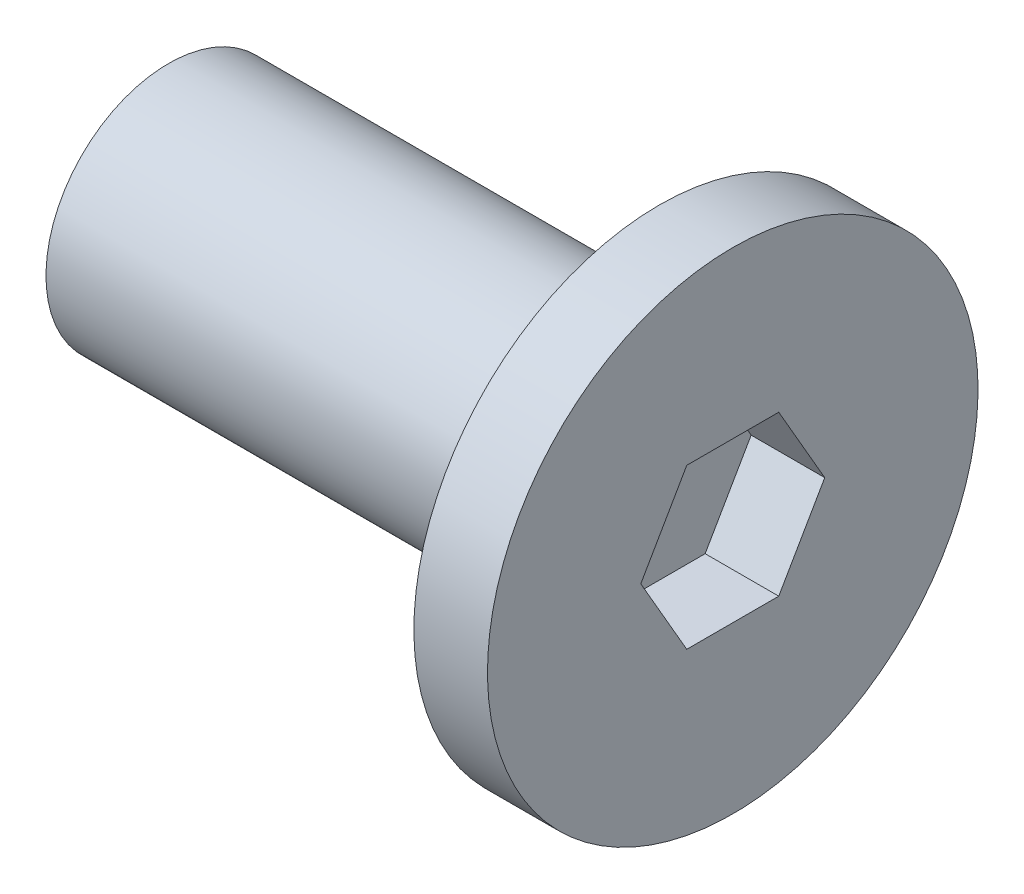
ISO-10303-21;
HEADER;
FILE_DESCRIPTION(('STEP AP214'),'2;1');
FILE_NAME('part.step','',(''),(''),'','','');
FILE_SCHEMA(('AUTOMOTIVE_DESIGN { 1 0 10303 214 1 1 1 1 }'));
ENDSEC;
DATA;
#1=APPLICATION_CONTEXT('core data for automotive mechanical design processes');
#2=APPLICATION_PROTOCOL_DEFINITION('international standard','automotive_design',2000,#1);
#3=PRODUCT_CONTEXT('',#1,'mechanical');
#4=PRODUCT('Part','Part','',(#3));
#5=PRODUCT_RELATED_PRODUCT_CATEGORY('part','',(#4));
#6=PRODUCT_DEFINITION_FORMATION('','',#4);
#7=PRODUCT_DEFINITION_CONTEXT('part definition',#1,'design');
#8=PRODUCT_DEFINITION('design','',#6,#7);
#9=PRODUCT_DEFINITION_SHAPE('','',#8);
#10=(LENGTH_UNIT() NAMED_UNIT(*) SI_UNIT(.MILLI.,.METRE.));
#11=(NAMED_UNIT(*) PLANE_ANGLE_UNIT() SI_UNIT($,.RADIAN.));
#12=(NAMED_UNIT(*) SI_UNIT($,.STERADIAN.) SOLID_ANGLE_UNIT());
#13=UNCERTAINTY_MEASURE_WITH_UNIT(LENGTH_MEASURE(1.E-05),#10,'distance_accuracy_value','');
#14=(GEOMETRIC_REPRESENTATION_CONTEXT(3) GLOBAL_UNCERTAINTY_ASSIGNED_CONTEXT((#13)) GLOBAL_UNIT_ASSIGNED_CONTEXT((#10,
#11,#12)) REPRESENTATION_CONTEXT('',''));
#15=CARTESIAN_POINT('',(0.,0.,0.));
#16=DIRECTION('',(0.,0.,1.));
#17=DIRECTION('',(1.,0.,0.));
#18=AXIS2_PLACEMENT_3D('',#15,#16,#17);
#19=CARTESIAN_POINT('',(0.,4.,0.));
#20=DIRECTION('',(1.,0.,0.));
#21=DIRECTION('',(0.,1.,0.));
#22=AXIS2_PLACEMENT_3D('',#19,#20,#21);
#23=PLANE('',#22);
#24=DIRECTION('',(0.,0.866025403784439,0.5));
#25=VECTOR('',#24,1.);
#26=CARTESIAN_POINT('',(0.,0.,-1.5));
#27=LINE('',#26,#25);
#28=CARTESIAN_POINT('',(0.,0.,-1.5));
#29=VERTEX_POINT('',#28);
#30=CARTESIAN_POINT('',(0.,1.29903810567666,-0.750000000000001));
#31=VERTEX_POINT('',#30);
#32=EDGE_CURVE('E55',#29,#31,#27,.T.);
#33=ORIENTED_EDGE('',*,*,#32,.F.);
#34=DIRECTION('',(0.,0.866025403784439,-0.5));
#35=VECTOR('',#34,1.);
#36=CARTESIAN_POINT('',(0.,-1.29903810567666,-0.750000000000001));
#37=LINE('',#36,#35);
#38=CARTESIAN_POINT('',(0.,-1.29903810567666,-0.750000000000001));
#39=VERTEX_POINT('',#38);
#40=EDGE_CURVE('E138',#39,#29,#37,.T.);
#41=ORIENTED_EDGE('',*,*,#40,.F.);
#42=DIRECTION('',(0.,0.,-1.));
#43=VECTOR('',#42,1.);
#44=CARTESIAN_POINT('',(0.,-1.29903810567666,0.749999999999999));
#45=LINE('',#44,#43);
#46=CARTESIAN_POINT('',(0.,-1.29903810567666,0.749999999999999));
#47=VERTEX_POINT('',#46);
#48=EDGE_CURVE('E136',#47,#39,#45,.T.);
#49=ORIENTED_EDGE('',*,*,#48,.F.);
#50=DIRECTION('',(0.,-0.866025403784439,-0.5));
#51=VECTOR('',#50,1.);
#52=CARTESIAN_POINT('',(0.,0.,1.5));
#53=LINE('',#52,#51);
#54=CARTESIAN_POINT('',(0.,0.,1.5));
#55=VERTEX_POINT('',#54);
#56=EDGE_CURVE('E103',#55,#47,#53,.T.);
#57=ORIENTED_EDGE('',*,*,#56,.F.);
#58=DIRECTION('',(0.,-0.866025403784439,0.5));
#59=VECTOR('',#58,1.);
#60=CARTESIAN_POINT('',(0.,1.29903810567666,0.749999999999999));
#61=LINE('',#60,#59);
#62=CARTESIAN_POINT('',(0.,1.29903810567666,0.749999999999999));
#63=VERTEX_POINT('',#62);
#64=EDGE_CURVE('E132',#63,#55,#61,.T.);
#65=ORIENTED_EDGE('',*,*,#64,.F.);
#66=DIRECTION('',(0.,0.,1.));
#67=VECTOR('',#66,1.);
#68=CARTESIAN_POINT('',(0.,1.29903810567666,-0.750000000000001));
#69=LINE('',#68,#67);
#70=EDGE_CURVE('E129',#31,#63,#69,.T.);
#71=ORIENTED_EDGE('',*,*,#70,.F.);
#72=EDGE_LOOP('',(#33,#41,#49,#57,#65,#71));
#73=FACE_BOUND('',#72,.T.);
#74=CARTESIAN_POINT('',(0.,0.,0.));
#75=DIRECTION('',(1.,0.,0.));
#76=DIRECTION('',(0.,1.,0.));
#77=AXIS2_PLACEMENT_3D('',#74,#75,#76);
#78=CIRCLE('',#77,4.);
#79=CARTESIAN_POINT('',(0.,4.,0.));
#80=VERTEX_POINT('',#79);
#81=EDGE_CURVE('E149',#80,#80,#78,.T.);
#82=ORIENTED_EDGE('',*,*,#81,.T.);
#83=EDGE_LOOP('',(#82));
#84=FACE_BOUND('',#83,.T.);
#85=ADVANCED_FACE('F40',(#73,#84),#23,.T.);
#86=CARTESIAN_POINT('',(-1.2,0.,0.));
#87=DIRECTION('',(-1.,0.,0.));
#88=DIRECTION('',(0.,-1.,0.));
#89=AXIS2_PLACEMENT_3D('',#86,#87,#88);
#90=PLANE('',#89);
#91=CARTESIAN_POINT('',(-1.2,0.,0.));
#92=DIRECTION('',(-1.,0.,0.));
#93=DIRECTION('',(0.,-1.,0.));
#94=AXIS2_PLACEMENT_3D('',#91,#92,#93);
#95=CIRCLE('',#94,2.);
#96=CARTESIAN_POINT('',(-1.2,-2.,0.));
#97=VERTEX_POINT('',#96);
#98=EDGE_CURVE('E11',#97,#97,#95,.T.);
#99=ORIENTED_EDGE('',*,*,#98,.F.);
#100=EDGE_LOOP('',(#99));
#101=FACE_BOUND('',#100,.T.);
#102=CARTESIAN_POINT('',(-1.2,0.,0.));
#103=DIRECTION('',(1.,0.,0.));
#104=DIRECTION('',(0.,1.,0.));
#105=AXIS2_PLACEMENT_3D('',#102,#103,#104);
#106=CIRCLE('',#105,4.);
#107=CARTESIAN_POINT('',(-1.2,4.,0.));
#108=VERTEX_POINT('',#107);
#109=EDGE_CURVE('E43',#108,#108,#106,.T.);
#110=ORIENTED_EDGE('',*,*,#109,.F.);
#111=EDGE_LOOP('',(#110));
#112=FACE_BOUND('',#111,.T.);
#113=ADVANCED_FACE('F159',(#101,#112),#90,.T.);
#114=CARTESIAN_POINT('',(0.,0.,0.));
#115=DIRECTION('',(1.,0.,0.));
#116=DIRECTION('',(0.,1.,0.));
#117=AXIS2_PLACEMENT_3D('',#114,#115,#116);
#118=CYLINDRICAL_SURFACE('',#117,4.);
#119=ORIENTED_EDGE('',*,*,#109,.T.);
#120=EDGE_LOOP('',(#119));
#121=FACE_BOUND('',#120,.T.);
#122=ORIENTED_EDGE('',*,*,#81,.F.);
#123=EDGE_LOOP('',(#122));
#124=FACE_BOUND('',#123,.T.);
#125=ADVANCED_FACE('F156',(#121,#124),#118,.T.);
#126=CARTESIAN_POINT('',(-9.2,0.,0.));
#127=DIRECTION('',(1.,0.,0.));
#128=DIRECTION('',(0.,1.,0.));
#129=AXIS2_PLACEMENT_3D('',#126,#127,#128);
#130=CYLINDRICAL_SURFACE('',#129,2.);
#131=CARTESIAN_POINT('',(-9.2,0.,0.));
#132=DIRECTION('',(-1.,0.,0.));
#133=DIRECTION('',(0.,-1.,0.));
#134=AXIS2_PLACEMENT_3D('',#131,#132,#133);
#135=CIRCLE('',#134,2.);
#136=CARTESIAN_POINT('',(-9.2,-2.,0.));
#137=VERTEX_POINT('',#136);
#138=EDGE_CURVE('E142',#137,#137,#135,.T.);
#139=ORIENTED_EDGE('',*,*,#138,.F.);
#140=EDGE_LOOP('',(#139));
#141=FACE_BOUND('',#140,.T.);
#142=ORIENTED_EDGE('',*,*,#98,.T.);
#143=EDGE_LOOP('',(#142));
#144=FACE_BOUND('',#143,.T.);
#145=ADVANCED_FACE('F166',(#141,#144),#130,.T.);
#146=CARTESIAN_POINT('',(-9.2,0.,0.));
#147=DIRECTION('',(-1.,0.,0.));
#148=DIRECTION('',(0.,-1.,0.));
#149=AXIS2_PLACEMENT_3D('',#146,#147,#148);
#150=PLANE('',#149);
#151=ORIENTED_EDGE('',*,*,#138,.T.);
#152=EDGE_LOOP('',(#151));
#153=FACE_BOUND('',#152,.T.);
#154=ADVANCED_FACE('F173',(#153),#150,.T.);
#155=CARTESIAN_POINT('',(-1.2,0.,-1.5));
#156=DIRECTION('',(0.,0.5,-0.866025403784439));
#157=DIRECTION('',(0.,0.866025403784439,0.5));
#158=AXIS2_PLACEMENT_3D('',#155,#156,#157);
#159=PLANE('',#158);
#160=ORIENTED_EDGE('',*,*,#32,.T.);
#161=DIRECTION('',(1.,0.,0.));
#162=VECTOR('',#161,1.);
#163=CARTESIAN_POINT('',(-1.2,1.29903810567666,-0.750000000000001));
#164=LINE('',#163,#162);
#165=CARTESIAN_POINT('',(-1.2,1.29903810567666,-0.750000000000001));
#166=VERTEX_POINT('',#165);
#167=EDGE_CURVE('E85',#166,#31,#164,.T.);
#168=ORIENTED_EDGE('',*,*,#167,.F.);
#169=DIRECTION('',(0.,0.866025403784439,0.5));
#170=VECTOR('',#169,1.);
#171=CARTESIAN_POINT('',(-1.2,0.,-1.5));
#172=LINE('',#171,#170);
#173=CARTESIAN_POINT('',(-1.2,0.,-1.5));
#174=VERTEX_POINT('',#173);
#175=EDGE_CURVE('E140',#174,#166,#172,.T.);
#176=ORIENTED_EDGE('',*,*,#175,.F.);
#177=DIRECTION('',(1.,0.,0.));
#178=VECTOR('',#177,1.);
#179=CARTESIAN_POINT('',(-1.2,0.,-1.5));
#180=LINE('',#179,#178);
#181=EDGE_CURVE('E63',#174,#29,#180,.T.);
#182=ORIENTED_EDGE('',*,*,#181,.T.);
#183=EDGE_LOOP('',(#160,#168,#176,#182));
#184=FACE_BOUND('',#183,.T.);
#185=ADVANCED_FACE('F177',(#184),#159,.F.);
#186=CARTESIAN_POINT('',(-1.2,-1.29903810567666,-0.750000000000001));
#187=DIRECTION('',(0.,-0.5,-0.866025403784439));
#188=DIRECTION('',(0.,0.866025403784439,-0.5));
#189=AXIS2_PLACEMENT_3D('',#186,#187,#188);
#190=PLANE('',#189);
#191=ORIENTED_EDGE('',*,*,#40,.T.);
#192=ORIENTED_EDGE('',*,*,#181,.F.);
#193=DIRECTION('',(0.,0.866025403784439,-0.5));
#194=VECTOR('',#193,1.);
#195=CARTESIAN_POINT('',(-1.2,-1.29903810567666,-0.750000000000001));
#196=LINE('',#195,#194);
#197=CARTESIAN_POINT('',(-1.2,-1.29903810567666,-0.750000000000001));
#198=VERTEX_POINT('',#197);
#199=EDGE_CURVE('E115',#198,#174,#196,.T.);
#200=ORIENTED_EDGE('',*,*,#199,.F.);
#201=DIRECTION('',(1.,0.,0.));
#202=VECTOR('',#201,1.);
#203=CARTESIAN_POINT('',(-1.2,-1.29903810567666,-0.750000000000001));
#204=LINE('',#203,#202);
#205=EDGE_CURVE('E107',#198,#39,#204,.T.);
#206=ORIENTED_EDGE('',*,*,#205,.T.);
#207=EDGE_LOOP('',(#191,#192,#200,#206));
#208=FACE_BOUND('',#207,.T.);
#209=ADVANCED_FACE('F181',(#208),#190,.F.);
#210=CARTESIAN_POINT('',(-1.2,-1.29903810567666,0.749999999999999));
#211=DIRECTION('',(0.,-1.,0.));
#212=DIRECTION('',(0.,0.,-1.));
#213=AXIS2_PLACEMENT_3D('',#210,#211,#212);
#214=PLANE('',#213);
#215=ORIENTED_EDGE('',*,*,#48,.T.);
#216=ORIENTED_EDGE('',*,*,#205,.F.);
#217=DIRECTION('',(0.,0.,-1.));
#218=VECTOR('',#217,1.);
#219=CARTESIAN_POINT('',(-1.2,-1.29903810567666,0.749999999999999));
#220=LINE('',#219,#218);
#221=CARTESIAN_POINT('',(-1.2,-1.29903810567666,0.749999999999999));
#222=VERTEX_POINT('',#221);
#223=EDGE_CURVE('E111',#222,#198,#220,.T.);
#224=ORIENTED_EDGE('',*,*,#223,.F.);
#225=DIRECTION('',(1.,0.,0.));
#226=VECTOR('',#225,1.);
#227=CARTESIAN_POINT('',(-1.2,-1.29903810567666,0.749999999999999));
#228=LINE('',#227,#226);
#229=EDGE_CURVE('E96',#222,#47,#228,.T.);
#230=ORIENTED_EDGE('',*,*,#229,.T.);
#231=EDGE_LOOP('',(#215,#216,#224,#230));
#232=FACE_BOUND('',#231,.T.);
#233=ADVANCED_FACE('F112',(#232),#214,.F.);
#234=CARTESIAN_POINT('',(-1.2,0.,1.5));
#235=DIRECTION('',(0.,-0.5,0.866025403784439));
#236=DIRECTION('',(0.,-0.866025403784439,-0.5));
#237=AXIS2_PLACEMENT_3D('',#234,#235,#236);
#238=PLANE('',#237);
#239=ORIENTED_EDGE('',*,*,#56,.T.);
#240=ORIENTED_EDGE('',*,*,#229,.F.);
#241=DIRECTION('',(0.,-0.866025403784439,-0.5));
#242=VECTOR('',#241,1.);
#243=CARTESIAN_POINT('',(-1.2,0.,1.5));
#244=LINE('',#243,#242);
#245=CARTESIAN_POINT('',(-1.2,0.,1.5));
#246=VERTEX_POINT('',#245);
#247=EDGE_CURVE('E100',#246,#222,#244,.T.);
#248=ORIENTED_EDGE('',*,*,#247,.F.);
#249=DIRECTION('',(1.,0.,0.));
#250=VECTOR('',#249,1.);
#251=CARTESIAN_POINT('',(-1.2,0.,1.5));
#252=LINE('',#251,#250);
#253=EDGE_CURVE('E108',#246,#55,#252,.T.);
#254=ORIENTED_EDGE('',*,*,#253,.T.);
#255=EDGE_LOOP('',(#239,#240,#248,#254));
#256=FACE_BOUND('',#255,.T.);
#257=ADVANCED_FACE('F98',(#256),#238,.F.);
#258=CARTESIAN_POINT('',(-1.2,1.29903810567666,0.749999999999999));
#259=DIRECTION('',(0.,0.5,0.866025403784439));
#260=DIRECTION('',(0.,-0.866025403784439,0.5));
#261=AXIS2_PLACEMENT_3D('',#258,#259,#260);
#262=PLANE('',#261);
#263=ORIENTED_EDGE('',*,*,#64,.T.);
#264=ORIENTED_EDGE('',*,*,#253,.F.);
#265=DIRECTION('',(0.,-0.866025403784439,0.5));
#266=VECTOR('',#265,1.);
#267=CARTESIAN_POINT('',(-1.2,1.29903810567666,0.749999999999999));
#268=LINE('',#267,#266);
#269=CARTESIAN_POINT('',(-1.2,1.29903810567666,0.749999999999999));
#270=VERTEX_POINT('',#269);
#271=EDGE_CURVE('E121',#270,#246,#268,.T.);
#272=ORIENTED_EDGE('',*,*,#271,.F.);
#273=DIRECTION('',(1.,0.,0.));
#274=VECTOR('',#273,1.);
#275=CARTESIAN_POINT('',(-1.2,1.29903810567666,0.749999999999999));
#276=LINE('',#275,#274);
#277=EDGE_CURVE('E145',#270,#63,#276,.T.);
#278=ORIENTED_EDGE('',*,*,#277,.T.);
#279=EDGE_LOOP('',(#263,#264,#272,#278));
#280=FACE_BOUND('',#279,.T.);
#281=ADVANCED_FACE('F185',(#280),#262,.F.);
#282=CARTESIAN_POINT('',(-1.2,1.29903810567666,-0.750000000000001));
#283=DIRECTION('',(0.,1.,0.));
#284=DIRECTION('',(-1.,0.,0.));
#285=AXIS2_PLACEMENT_3D('',#282,#283,#284);
#286=PLANE('',#285);
#287=ORIENTED_EDGE('',*,*,#70,.T.);
#288=ORIENTED_EDGE('',*,*,#277,.F.);
#289=DIRECTION('',(0.,0.,1.));
#290=VECTOR('',#289,1.);
#291=CARTESIAN_POINT('',(-1.2,1.29903810567666,-0.750000000000001));
#292=LINE('',#291,#290);
#293=EDGE_CURVE('E123',#166,#270,#292,.T.);
#294=ORIENTED_EDGE('',*,*,#293,.F.);
#295=ORIENTED_EDGE('',*,*,#167,.T.);
#296=EDGE_LOOP('',(#287,#288,#294,#295));
#297=FACE_BOUND('',#296,.T.);
#298=ADVANCED_FACE('F182',(#297),#286,.F.);
#299=CARTESIAN_POINT('',(-1.2,0.,0.));
#300=DIRECTION('',(1.,0.,0.));
#301=DIRECTION('',(0.,1.,0.));
#302=AXIS2_PLACEMENT_3D('',#299,#300,#301);
#303=PLANE('',#302);
#304=ORIENTED_EDGE('',*,*,#175,.T.);
#305=ORIENTED_EDGE('',*,*,#293,.T.);
#306=ORIENTED_EDGE('',*,*,#271,.T.);
#307=ORIENTED_EDGE('',*,*,#247,.T.);
#308=ORIENTED_EDGE('',*,*,#223,.T.);
#309=ORIENTED_EDGE('',*,*,#199,.T.);
#310=EDGE_LOOP('',(#304,#305,#306,#307,#308,#309));
#311=FACE_BOUND('',#310,.T.);
#312=ADVANCED_FACE('F118',(#311),#303,.T.);
#313=CLOSED_SHELL('',(#85,#113,#125,#145,#154,#185,#209,#233,#257,#281,#298,#312));
#314=MANIFOLD_SOLID_BREP('B2',#313);
#315=ADVANCED_BREP_SHAPE_REPRESENTATION('',(#18,#314),#14);
#316=SHAPE_DEFINITION_REPRESENTATION(#9,#315);
ENDSEC;
END-ISO-10303-21;
